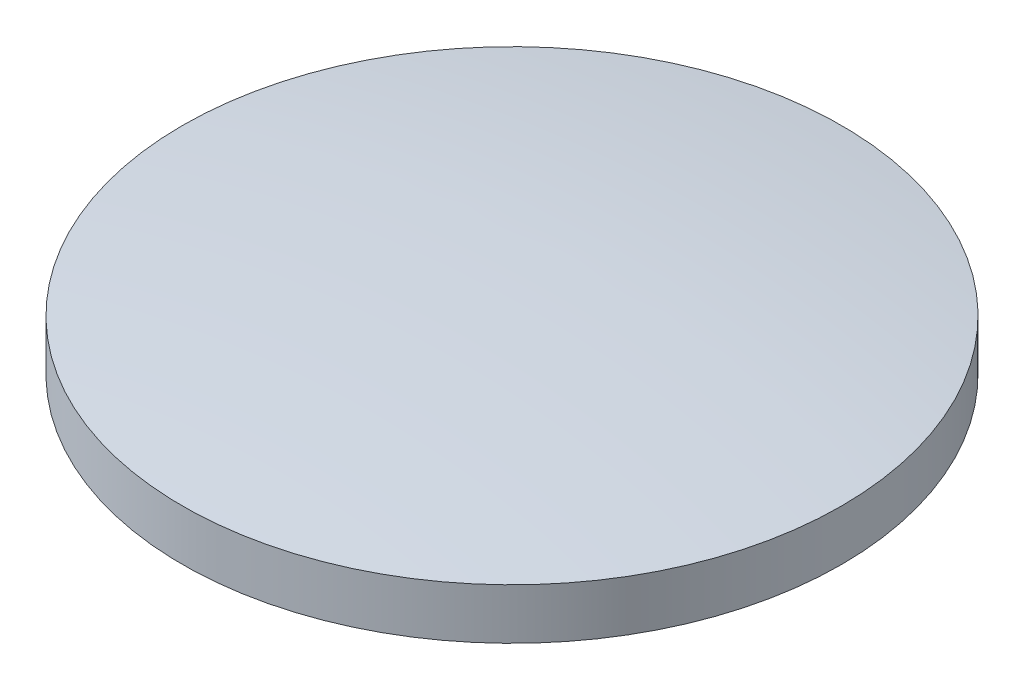
ISO-10303-21;
HEADER;
FILE_DESCRIPTION(('STEP AP214'),'2;1');
FILE_NAME('part.step','',(''),(''),'','','');
FILE_SCHEMA(('AUTOMOTIVE_DESIGN { 1 0 10303 214 1 1 1 1 }'));
ENDSEC;
DATA;
#1=APPLICATION_CONTEXT('core data for automotive mechanical design processes');
#2=APPLICATION_PROTOCOL_DEFINITION('international standard','automotive_design',2000,#1);
#3=PRODUCT_CONTEXT('',#1,'mechanical');
#4=PRODUCT('Part','Part','',(#3));
#5=PRODUCT_RELATED_PRODUCT_CATEGORY('part','',(#4));
#6=PRODUCT_DEFINITION_FORMATION('','',#4);
#7=PRODUCT_DEFINITION_CONTEXT('part definition',#1,'design');
#8=PRODUCT_DEFINITION('design','',#6,#7);
#9=PRODUCT_DEFINITION_SHAPE('','',#8);
#10=(LENGTH_UNIT() NAMED_UNIT(*) SI_UNIT(.MILLI.,.METRE.));
#11=(NAMED_UNIT(*) PLANE_ANGLE_UNIT() SI_UNIT($,.RADIAN.));
#12=(NAMED_UNIT(*) SI_UNIT($,.STERADIAN.) SOLID_ANGLE_UNIT());
#13=UNCERTAINTY_MEASURE_WITH_UNIT(LENGTH_MEASURE(1.E-05),#10,'distance_accuracy_value','');
#14=(GEOMETRIC_REPRESENTATION_CONTEXT(3) GLOBAL_UNCERTAINTY_ASSIGNED_CONTEXT((#13)) GLOBAL_UNIT_ASSIGNED_CONTEXT((#10,
#11,#12)) REPRESENTATION_CONTEXT('',''));
#15=CARTESIAN_POINT('',(0.,0.,0.));
#16=DIRECTION('',(0.,0.,1.));
#17=DIRECTION('',(1.,0.,0.));
#18=AXIS2_PLACEMENT_3D('',#15,#16,#17);
#19=CARTESIAN_POINT('',(0.,-334.620000000004,0.));
#20=DIRECTION('',(0.,-1.,0.));
#21=DIRECTION('',(1.,0.,0.));
#22=AXIS2_PLACEMENT_3D('',#19,#20,#21);
#23=SPHERICAL_SURFACE('',#22,332.000000000004);
#24=CARTESIAN_POINT('',(0.,-5.75262551599931,0.));
#25=DIRECTION('',(0.,-1.,0.));
#26=DIRECTION('',(1.,0.,0.));
#27=AXIS2_PLACEMENT_3D('',#24,#25,#26);
#28=CIRCLE('',#27,45.5);
#29=CARTESIAN_POINT('',(45.5,-5.7526255159992,0.));
#30=VERTEX_POINT('',#29);
#31=EDGE_CURVE('E10',#30,#30,#28,.T.);
#32=ORIENTED_EDGE('',*,*,#31,.F.);
#33=EDGE_LOOP('',(#32));
#34=FACE_BOUND('',#33,.T.);
#35=ADVANCED_FACE('F33',(#34),#23,.T.);
#36=CARTESIAN_POINT('',(0.,-12.7526255159992,0.));
#37=DIRECTION('',(0.,-1.,0.));
#38=DIRECTION('',(1.,0.,0.));
#39=AXIS2_PLACEMENT_3D('',#36,#37,#38);
#40=CYLINDRICAL_SURFACE('',#39,45.5);
#41=ORIENTED_EDGE('',*,*,#31,.T.);
#42=EDGE_LOOP('',(#41));
#43=FACE_BOUND('',#42,.T.);
#44=CARTESIAN_POINT('',(0.,-12.7526255159993,0.));
#45=DIRECTION('',(0.,-1.,0.));
#46=DIRECTION('',(1.,0.,0.));
#47=AXIS2_PLACEMENT_3D('',#44,#45,#46);
#48=CIRCLE('',#47,45.5);
#49=CARTESIAN_POINT('',(45.5,-12.7526255159992,0.));
#50=VERTEX_POINT('',#49);
#51=EDGE_CURVE('E39',#50,#50,#48,.T.);
#52=ORIENTED_EDGE('',*,*,#51,.F.);
#53=EDGE_LOOP('',(#52));
#54=FACE_BOUND('',#53,.T.);
#55=ADVANCED_FACE('F47',(#43,#54),#40,.T.);
#56=CARTESIAN_POINT('',(45.5,-12.7526255159991,0.));
#57=DIRECTION('',(0.,-1.,0.));
#58=DIRECTION('',(1.,0.,0.));
#59=AXIS2_PLACEMENT_3D('',#56,#57,#58);
#60=PLANE('',#59);
#61=ORIENTED_EDGE('',*,*,#51,.T.);
#62=EDGE_LOOP('',(#61));
#63=FACE_BOUND('',#62,.T.);
#64=ADVANCED_FACE('F45',(#63),#60,.T.);
#65=CLOSED_SHELL('',(#35,#55,#64));
#66=MANIFOLD_SOLID_BREP('B2',#65);
#67=ADVANCED_BREP_SHAPE_REPRESENTATION('',(#18,#66),#14);
#68=SHAPE_DEFINITION_REPRESENTATION(#9,#67);
ENDSEC;
END-ISO-10303-21;
